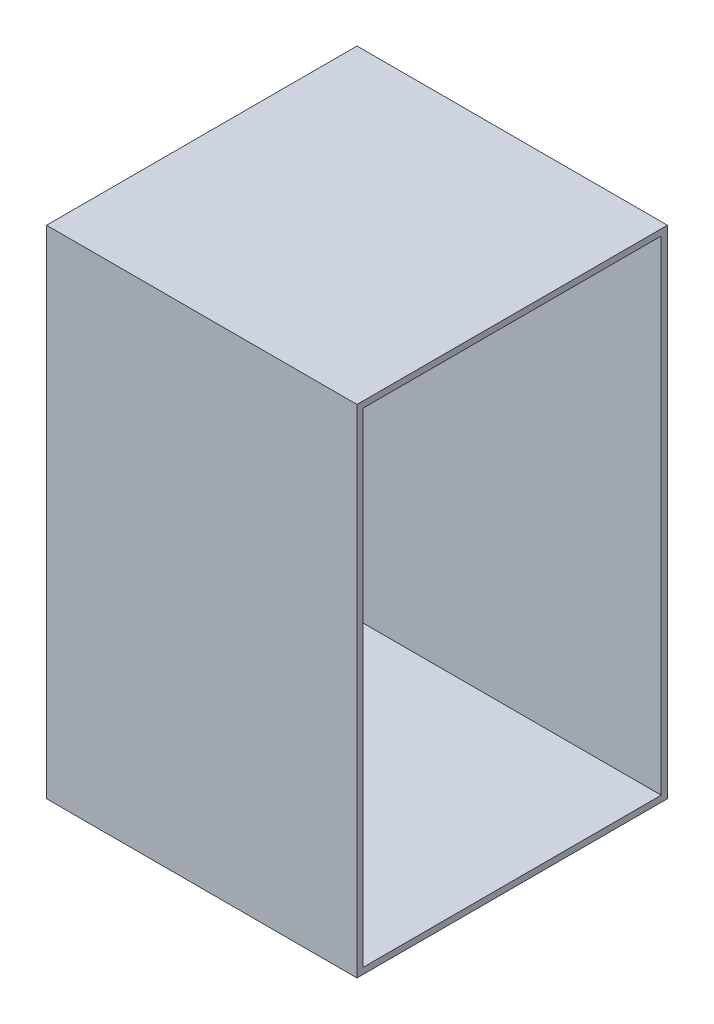
ISO-10303-21;
HEADER;
FILE_DESCRIPTION(('STEP AP214'),'2;1');
FILE_NAME('part.step','',(''),(''),'','','');
FILE_SCHEMA(('AUTOMOTIVE_DESIGN { 1 0 10303 214 1 1 1 1 }'));
ENDSEC;
DATA;
#1=APPLICATION_CONTEXT('core data for automotive mechanical design processes');
#2=APPLICATION_PROTOCOL_DEFINITION('international standard','automotive_design',2000,#1);
#3=PRODUCT_CONTEXT('',#1,'mechanical');
#4=PRODUCT('Part','Part','',(#3));
#5=PRODUCT_RELATED_PRODUCT_CATEGORY('part','',(#4));
#6=PRODUCT_DEFINITION_FORMATION('','',#4);
#7=PRODUCT_DEFINITION_CONTEXT('part definition',#1,'design');
#8=PRODUCT_DEFINITION('design','',#6,#7);
#9=PRODUCT_DEFINITION_SHAPE('','',#8);
#10=(LENGTH_UNIT() NAMED_UNIT(*) SI_UNIT(.MILLI.,.METRE.));
#11=(NAMED_UNIT(*) PLANE_ANGLE_UNIT() SI_UNIT($,.RADIAN.));
#12=(NAMED_UNIT(*) SI_UNIT($,.STERADIAN.) SOLID_ANGLE_UNIT());
#13=UNCERTAINTY_MEASURE_WITH_UNIT(LENGTH_MEASURE(1.E-05),#10,'distance_accuracy_value','');
#14=(GEOMETRIC_REPRESENTATION_CONTEXT(3) GLOBAL_UNCERTAINTY_ASSIGNED_CONTEXT((#13)) GLOBAL_UNIT_ASSIGNED_CONTEXT((#10,
#11,#12)) REPRESENTATION_CONTEXT('',''));
#15=CARTESIAN_POINT('',(0.,0.,0.));
#16=DIRECTION('',(0.,0.,1.));
#17=DIRECTION('',(1.,0.,0.));
#18=AXIS2_PLACEMENT_3D('',#15,#16,#17);
#19=CARTESIAN_POINT('',(-250.,400.,-250.));
#20=DIRECTION('',(1.,0.,0.));
#21=DIRECTION('',(0.,0.,-1.));
#22=AXIS2_PLACEMENT_3D('',#19,#20,#21);
#23=PLANE('',#22);
#24=DIRECTION('',(0.,0.,1.));
#25=VECTOR('',#24,1.);
#26=CARTESIAN_POINT('',(-250.,-400.,-250.));
#27=LINE('',#26,#25);
#28=CARTESIAN_POINT('',(-250.,-400.,-250.));
#29=VERTEX_POINT('',#28);
#30=CARTESIAN_POINT('',(-250.,-400.,250.));
#31=VERTEX_POINT('',#30);
#32=EDGE_CURVE('E158',#29,#31,#27,.T.);
#33=ORIENTED_EDGE('',*,*,#32,.T.);
#34=DIRECTION('',(0.,-1.,0.));
#35=VECTOR('',#34,1.);
#36=CARTESIAN_POINT('',(-250.,400.,250.));
#37=LINE('',#36,#35);
#38=CARTESIAN_POINT('',(-250.,400.,250.));
#39=VERTEX_POINT('',#38);
#40=EDGE_CURVE('E11',#39,#31,#37,.T.);
#41=ORIENTED_EDGE('',*,*,#40,.F.);
#42=DIRECTION('',(0.,0.,1.));
#43=VECTOR('',#42,1.);
#44=CARTESIAN_POINT('',(-250.,400.,-250.));
#45=LINE('',#44,#43);
#46=CARTESIAN_POINT('',(-250.,400.,-250.));
#47=VERTEX_POINT('',#46);
#48=EDGE_CURVE('E164',#47,#39,#45,.T.);
#49=ORIENTED_EDGE('',*,*,#48,.F.);
#50=DIRECTION('',(0.,-1.,0.));
#51=VECTOR('',#50,1.);
#52=CARTESIAN_POINT('',(-250.,400.,-250.));
#53=LINE('',#52,#51);
#54=EDGE_CURVE('E174',#47,#29,#53,.T.);
#55=ORIENTED_EDGE('',*,*,#54,.T.);
#56=EDGE_LOOP('',(#33,#41,#49,#55));
#57=FACE_BOUND('',#56,.T.);
#58=ADVANCED_FACE('F39',(#57),#23,.F.);
#59=CARTESIAN_POINT('',(-250.,400.,250.));
#60=DIRECTION('',(0.,0.,-1.));
#61=DIRECTION('',(-1.,0.,0.));
#62=AXIS2_PLACEMENT_3D('',#59,#60,#61);
#63=PLANE('',#62);
#64=DIRECTION('',(1.,0.,0.));
#65=VECTOR('',#64,1.);
#66=CARTESIAN_POINT('',(-250.,-400.,250.));
#67=LINE('',#66,#65);
#68=CARTESIAN_POINT('',(250.,-400.,250.));
#69=VERTEX_POINT('',#68);
#70=EDGE_CURVE('E178',#31,#69,#67,.T.);
#71=ORIENTED_EDGE('',*,*,#70,.T.);
#72=DIRECTION('',(0.,-1.,0.));
#73=VECTOR('',#72,1.);
#74=CARTESIAN_POINT('',(250.,400.,250.));
#75=LINE('',#74,#73);
#76=CARTESIAN_POINT('',(250.,400.,250.));
#77=VERTEX_POINT('',#76);
#78=EDGE_CURVE('E47',#77,#69,#75,.T.);
#79=ORIENTED_EDGE('',*,*,#78,.F.);
#80=DIRECTION('',(1.,0.,0.));
#81=VECTOR('',#80,1.);
#82=CARTESIAN_POINT('',(-250.,400.,250.));
#83=LINE('',#82,#81);
#84=EDGE_CURVE('E91',#39,#77,#83,.T.);
#85=ORIENTED_EDGE('',*,*,#84,.F.);
#86=ORIENTED_EDGE('',*,*,#40,.T.);
#87=EDGE_LOOP('',(#71,#79,#85,#86));
#88=FACE_BOUND('',#87,.T.);
#89=ADVANCED_FACE('F212',(#88),#63,.F.);
#90=CARTESIAN_POINT('',(250.,400.,-250.));
#91=DIRECTION('',(-1.,0.,0.));
#92=DIRECTION('',(0.,0.,1.));
#93=AXIS2_PLACEMENT_3D('',#90,#91,#92);
#94=PLANE('',#93);
#95=DIRECTION('',(0.,0.,-1.));
#96=VECTOR('',#95,1.);
#97=CARTESIAN_POINT('',(250.,-390.,240.));
#98=LINE('',#97,#96);
#99=CARTESIAN_POINT('',(250.,-390.,240.));
#100=VERTEX_POINT('',#99);
#101=CARTESIAN_POINT('',(250.,-390.,-240.));
#102=VERTEX_POINT('',#101);
#103=EDGE_CURVE('E149',#100,#102,#98,.T.);
#104=ORIENTED_EDGE('',*,*,#103,.F.);
#105=DIRECTION('',(0.,-1.,0.));
#106=VECTOR('',#105,1.);
#107=CARTESIAN_POINT('',(250.,390.,240.));
#108=LINE('',#107,#106);
#109=CARTESIAN_POINT('',(250.,390.,240.));
#110=VERTEX_POINT('',#109);
#111=EDGE_CURVE('E54',#110,#100,#108,.T.);
#112=ORIENTED_EDGE('',*,*,#111,.F.);
#113=DIRECTION('',(0.,0.,1.));
#114=VECTOR('',#113,1.);
#115=CARTESIAN_POINT('',(250.,390.,240.));
#116=LINE('',#115,#114);
#117=CARTESIAN_POINT('',(250.,390.,-240.));
#118=VERTEX_POINT('',#117);
#119=EDGE_CURVE('E136',#118,#110,#116,.T.);
#120=ORIENTED_EDGE('',*,*,#119,.F.);
#121=DIRECTION('',(0.,1.,0.));
#122=VECTOR('',#121,1.);
#123=CARTESIAN_POINT('',(250.,390.,-240.));
#124=LINE('',#123,#122);
#125=EDGE_CURVE('E140',#102,#118,#124,.T.);
#126=ORIENTED_EDGE('',*,*,#125,.F.);
#127=EDGE_LOOP('',(#104,#112,#120,#126));
#128=FACE_BOUND('',#127,.T.);
#129=DIRECTION('',(0.,0.,-1.));
#130=VECTOR('',#129,1.);
#131=CARTESIAN_POINT('',(250.,-400.,-250.));
#132=LINE('',#131,#130);
#133=CARTESIAN_POINT('',(250.,-400.,-250.));
#134=VERTEX_POINT('',#133);
#135=EDGE_CURVE('E181',#69,#134,#132,.T.);
#136=ORIENTED_EDGE('',*,*,#135,.T.);
#137=DIRECTION('',(0.,-1.,0.));
#138=VECTOR('',#137,1.);
#139=CARTESIAN_POINT('',(250.,400.,-250.));
#140=LINE('',#139,#138);
#141=CARTESIAN_POINT('',(250.,400.,-250.));
#142=VERTEX_POINT('',#141);
#143=EDGE_CURVE('E188',#142,#134,#140,.T.);
#144=ORIENTED_EDGE('',*,*,#143,.F.);
#145=DIRECTION('',(0.,0.,-1.));
#146=VECTOR('',#145,1.);
#147=CARTESIAN_POINT('',(250.,400.,-250.));
#148=LINE('',#147,#146);
#149=EDGE_CURVE('E169',#77,#142,#148,.T.);
#150=ORIENTED_EDGE('',*,*,#149,.F.);
#151=ORIENTED_EDGE('',*,*,#78,.T.);
#152=EDGE_LOOP('',(#136,#144,#150,#151));
#153=FACE_BOUND('',#152,.T.);
#154=ADVANCED_FACE('F195',(#128,#153),#94,.F.);
#155=CARTESIAN_POINT('',(-250.,400.,-250.));
#156=DIRECTION('',(0.,0.,1.));
#157=DIRECTION('',(1.,0.,0.));
#158=AXIS2_PLACEMENT_3D('',#155,#156,#157);
#159=PLANE('',#158);
#160=DIRECTION('',(-1.,0.,0.));
#161=VECTOR('',#160,1.);
#162=CARTESIAN_POINT('',(-250.,-400.,-250.));
#163=LINE('',#162,#161);
#164=EDGE_CURVE('E84',#134,#29,#163,.T.);
#165=ORIENTED_EDGE('',*,*,#164,.T.);
#166=ORIENTED_EDGE('',*,*,#54,.F.);
#167=DIRECTION('',(-1.,0.,0.));
#168=VECTOR('',#167,1.);
#169=CARTESIAN_POINT('',(-250.,400.,-250.));
#170=LINE('',#169,#168);
#171=EDGE_CURVE('E63',#142,#47,#170,.T.);
#172=ORIENTED_EDGE('',*,*,#171,.F.);
#173=ORIENTED_EDGE('',*,*,#143,.T.);
#174=EDGE_LOOP('',(#165,#166,#172,#173));
#175=FACE_BOUND('',#174,.T.);
#176=ADVANCED_FACE('F203',(#175),#159,.F.);
#177=CARTESIAN_POINT('',(0.,400.,0.));
#178=DIRECTION('',(0.,1.,0.));
#179=DIRECTION('',(0.,0.,1.));
#180=AXIS2_PLACEMENT_3D('',#177,#178,#179);
#181=PLANE('',#180);
#182=ORIENTED_EDGE('',*,*,#48,.T.);
#183=ORIENTED_EDGE('',*,*,#84,.T.);
#184=ORIENTED_EDGE('',*,*,#149,.T.);
#185=ORIENTED_EDGE('',*,*,#171,.T.);
#186=EDGE_LOOP('',(#182,#183,#184,#185));
#187=FACE_BOUND('',#186,.T.);
#188=ADVANCED_FACE('F205',(#187),#181,.T.);
#189=CARTESIAN_POINT('',(0.,-400.,0.));
#190=DIRECTION('',(0.,1.,0.));
#191=DIRECTION('',(0.,0.,1.));
#192=AXIS2_PLACEMENT_3D('',#189,#190,#191);
#193=PLANE('',#192);
#194=ORIENTED_EDGE('',*,*,#32,.F.);
#195=ORIENTED_EDGE('',*,*,#164,.F.);
#196=ORIENTED_EDGE('',*,*,#135,.F.);
#197=ORIENTED_EDGE('',*,*,#70,.F.);
#198=EDGE_LOOP('',(#194,#195,#196,#197));
#199=FACE_BOUND('',#198,.T.);
#200=ADVANCED_FACE('F199',(#199),#193,.F.);
#201=CARTESIAN_POINT('',(-240.,390.,240.));
#202=DIRECTION('',(0.,0.,1.));
#203=DIRECTION('',(1.,0.,0.));
#204=AXIS2_PLACEMENT_3D('',#201,#202,#203);
#205=PLANE('',#204);
#206=ORIENTED_EDGE('',*,*,#111,.T.);
#207=DIRECTION('',(1.,0.,0.));
#208=VECTOR('',#207,1.);
#209=CARTESIAN_POINT('',(-240.,-390.,240.));
#210=LINE('',#209,#208);
#211=CARTESIAN_POINT('',(-240.,-390.,240.));
#212=VERTEX_POINT('',#211);
#213=EDGE_CURVE('E111',#212,#100,#210,.T.);
#214=ORIENTED_EDGE('',*,*,#213,.F.);
#215=DIRECTION('',(0.,-1.,0.));
#216=VECTOR('',#215,1.);
#217=CARTESIAN_POINT('',(-240.,390.,240.));
#218=LINE('',#217,#216);
#219=CARTESIAN_POINT('',(-240.,390.,240.));
#220=VERTEX_POINT('',#219);
#221=EDGE_CURVE('E115',#220,#212,#218,.T.);
#222=ORIENTED_EDGE('',*,*,#221,.F.);
#223=DIRECTION('',(1.,0.,0.));
#224=VECTOR('',#223,1.);
#225=CARTESIAN_POINT('',(-240.,390.,240.));
#226=LINE('',#225,#224);
#227=EDGE_CURVE('E155',#220,#110,#226,.T.);
#228=ORIENTED_EDGE('',*,*,#227,.T.);
#229=EDGE_LOOP('',(#206,#214,#222,#228));
#230=FACE_BOUND('',#229,.T.);
#231=ADVANCED_FACE('F113',(#230),#205,.F.);
#232=CARTESIAN_POINT('',(-240.,390.,240.));
#233=DIRECTION('',(0.,1.,0.));
#234=DIRECTION('',(0.,0.,1.));
#235=AXIS2_PLACEMENT_3D('',#232,#233,#234);
#236=PLANE('',#235);
#237=ORIENTED_EDGE('',*,*,#119,.T.);
#238=ORIENTED_EDGE('',*,*,#227,.F.);
#239=DIRECTION('',(0.,0.,1.));
#240=VECTOR('',#239,1.);
#241=CARTESIAN_POINT('',(-240.,390.,240.));
#242=LINE('',#241,#240);
#243=CARTESIAN_POINT('',(-240.,390.,-240.));
#244=VERTEX_POINT('',#243);
#245=EDGE_CURVE('E122',#244,#220,#242,.T.);
#246=ORIENTED_EDGE('',*,*,#245,.F.);
#247=DIRECTION('',(1.,0.,0.));
#248=VECTOR('',#247,1.);
#249=CARTESIAN_POINT('',(-240.,390.,-240.));
#250=LINE('',#249,#248);
#251=EDGE_CURVE('E159',#244,#118,#250,.T.);
#252=ORIENTED_EDGE('',*,*,#251,.T.);
#253=EDGE_LOOP('',(#237,#238,#246,#252));
#254=FACE_BOUND('',#253,.T.);
#255=ADVANCED_FACE('F241',(#254),#236,.F.);
#256=CARTESIAN_POINT('',(-240.,390.,-240.));
#257=DIRECTION('',(0.,0.,-1.));
#258=DIRECTION('',(-1.,0.,0.));
#259=AXIS2_PLACEMENT_3D('',#256,#257,#258);
#260=PLANE('',#259);
#261=ORIENTED_EDGE('',*,*,#125,.T.);
#262=ORIENTED_EDGE('',*,*,#251,.F.);
#263=DIRECTION('',(0.,1.,0.));
#264=VECTOR('',#263,1.);
#265=CARTESIAN_POINT('',(-240.,390.,-240.));
#266=LINE('',#265,#264);
#267=CARTESIAN_POINT('',(-240.,-390.,-240.));
#268=VERTEX_POINT('',#267);
#269=EDGE_CURVE('E131',#268,#244,#266,.T.);
#270=ORIENTED_EDGE('',*,*,#269,.F.);
#271=DIRECTION('',(1.,0.,0.));
#272=VECTOR('',#271,1.);
#273=CARTESIAN_POINT('',(-240.,-390.,-240.));
#274=LINE('',#273,#272);
#275=EDGE_CURVE('E121',#268,#102,#274,.T.);
#276=ORIENTED_EDGE('',*,*,#275,.T.);
#277=EDGE_LOOP('',(#261,#262,#270,#276));
#278=FACE_BOUND('',#277,.T.);
#279=ADVANCED_FACE('F250',(#278),#260,.F.);
#280=CARTESIAN_POINT('',(-240.,-390.,240.));
#281=DIRECTION('',(0.,-1.,0.));
#282=DIRECTION('',(0.,0.,-1.));
#283=AXIS2_PLACEMENT_3D('',#280,#281,#282);
#284=PLANE('',#283);
#285=ORIENTED_EDGE('',*,*,#103,.T.);
#286=ORIENTED_EDGE('',*,*,#275,.F.);
#287=DIRECTION('',(0.,0.,-1.));
#288=VECTOR('',#287,1.);
#289=CARTESIAN_POINT('',(-240.,-390.,240.));
#290=LINE('',#289,#288);
#291=EDGE_CURVE('E125',#212,#268,#290,.T.);
#292=ORIENTED_EDGE('',*,*,#291,.F.);
#293=ORIENTED_EDGE('',*,*,#213,.T.);
#294=EDGE_LOOP('',(#285,#286,#292,#293));
#295=FACE_BOUND('',#294,.T.);
#296=ADVANCED_FACE('F126',(#295),#284,.F.);
#297=CARTESIAN_POINT('',(-240.,0.,0.));
#298=DIRECTION('',(1.,0.,0.));
#299=DIRECTION('',(0.,0.,-1.));
#300=AXIS2_PLACEMENT_3D('',#297,#298,#299);
#301=PLANE('',#300);
#302=ORIENTED_EDGE('',*,*,#221,.T.);
#303=ORIENTED_EDGE('',*,*,#291,.T.);
#304=ORIENTED_EDGE('',*,*,#269,.T.);
#305=ORIENTED_EDGE('',*,*,#245,.T.);
#306=EDGE_LOOP('',(#302,#303,#304,#305));
#307=FACE_BOUND('',#306,.T.);
#308=ADVANCED_FACE('F133',(#307),#301,.T.);
#309=CLOSED_SHELL('',(#58,#89,#154,#176,#188,#200,#231,#255,#279,#296,#308));
#310=MANIFOLD_SOLID_BREP('B2',#309);
#311=ADVANCED_BREP_SHAPE_REPRESENTATION('',(#18,#310),#14);
#312=SHAPE_DEFINITION_REPRESENTATION(#9,#311);
ENDSEC;
END-ISO-10303-21;
